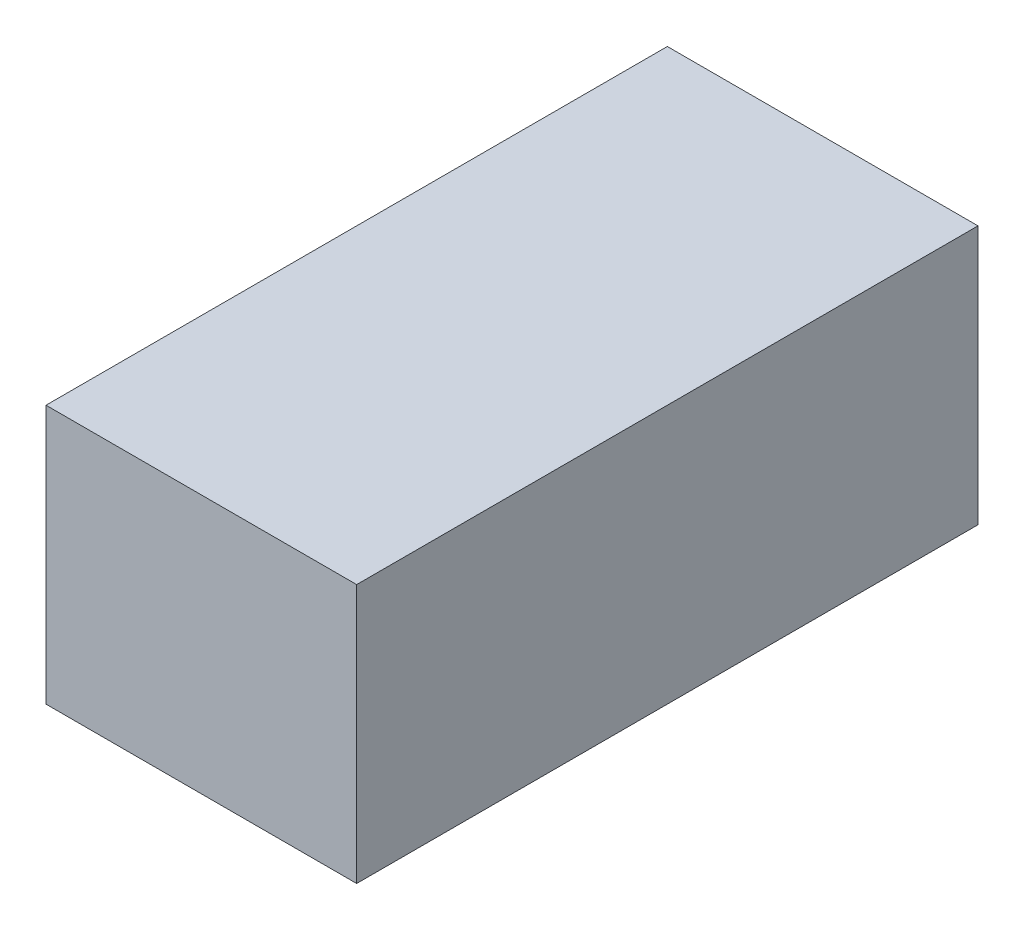
ISO-10303-21;
HEADER;
FILE_DESCRIPTION(('STEP AP214'),'2;1');
FILE_NAME('part.step','',(''),(''),'','','');
FILE_SCHEMA(('AUTOMOTIVE_DESIGN { 1 0 10303 214 1 1 1 1 }'));
ENDSEC;
DATA;
#1=APPLICATION_CONTEXT('core data for automotive mechanical design processes');
#2=APPLICATION_PROTOCOL_DEFINITION('international standard','automotive_design',2000,#1);
#3=PRODUCT_CONTEXT('',#1,'mechanical');
#4=PRODUCT('Part','Part','',(#3));
#5=PRODUCT_RELATED_PRODUCT_CATEGORY('part','',(#4));
#6=PRODUCT_DEFINITION_FORMATION('','',#4);
#7=PRODUCT_DEFINITION_CONTEXT('part definition',#1,'design');
#8=PRODUCT_DEFINITION('design','',#6,#7);
#9=PRODUCT_DEFINITION_SHAPE('','',#8);
#10=(LENGTH_UNIT() NAMED_UNIT(*) SI_UNIT(.MILLI.,.METRE.));
#11=(NAMED_UNIT(*) PLANE_ANGLE_UNIT() SI_UNIT($,.RADIAN.));
#12=(NAMED_UNIT(*) SI_UNIT($,.STERADIAN.) SOLID_ANGLE_UNIT());
#13=UNCERTAINTY_MEASURE_WITH_UNIT(LENGTH_MEASURE(1.E-05),#10,'distance_accuracy_value','');
#14=(GEOMETRIC_REPRESENTATION_CONTEXT(3) GLOBAL_UNCERTAINTY_ASSIGNED_CONTEXT((#13)) GLOBAL_UNIT_ASSIGNED_CONTEXT((#10,
#11,#12)) REPRESENTATION_CONTEXT('',''));
#15=CARTESIAN_POINT('',(0.,0.,0.));
#16=DIRECTION('',(0.,0.,1.));
#17=DIRECTION('',(1.,0.,0.));
#18=AXIS2_PLACEMENT_3D('',#15,#16,#17);
#19=CARTESIAN_POINT('',(152.4,254.,-304.8));
#20=DIRECTION('',(-1.,0.,0.));
#21=DIRECTION('',(0.,0.,1.));
#22=AXIS2_PLACEMENT_3D('',#19,#20,#21);
#23=PLANE('',#22);
#24=DIRECTION('',(0.,0.,-1.));
#25=VECTOR('',#24,1.);
#26=CARTESIAN_POINT('',(152.4,0.,-304.8));
#27=LINE('',#26,#25);
#28=CARTESIAN_POINT('',(152.4,0.,304.8));
#29=VERTEX_POINT('',#28);
#30=CARTESIAN_POINT('',(152.4,0.,-304.8));
#31=VERTEX_POINT('',#30);
#32=EDGE_CURVE('E103',#29,#31,#27,.T.);
#33=ORIENTED_EDGE('',*,*,#32,.T.);
#34=DIRECTION('',(0.,-1.,0.));
#35=VECTOR('',#34,1.);
#36=CARTESIAN_POINT('',(152.4,254.,-304.8));
#37=LINE('',#36,#35);
#38=CARTESIAN_POINT('',(152.4,254.,-304.8));
#39=VERTEX_POINT('',#38);
#40=EDGE_CURVE('E11',#39,#31,#37,.T.);
#41=ORIENTED_EDGE('',*,*,#40,.F.);
#42=DIRECTION('',(0.,0.,-1.));
#43=VECTOR('',#42,1.);
#44=CARTESIAN_POINT('',(152.4,254.,-304.8));
#45=LINE('',#44,#43);
#46=CARTESIAN_POINT('',(152.4,254.,304.8));
#47=VERTEX_POINT('',#46);
#48=EDGE_CURVE('E91',#47,#39,#45,.T.);
#49=ORIENTED_EDGE('',*,*,#48,.F.);
#50=DIRECTION('',(0.,-1.,0.));
#51=VECTOR('',#50,1.);
#52=CARTESIAN_POINT('',(152.4,254.,304.8));
#53=LINE('',#52,#51);
#54=EDGE_CURVE('E99',#47,#29,#53,.T.);
#55=ORIENTED_EDGE('',*,*,#54,.T.);
#56=EDGE_LOOP('',(#33,#41,#49,#55));
#57=FACE_BOUND('',#56,.T.);
#58=ADVANCED_FACE('F40',(#57),#23,.F.);
#59=CARTESIAN_POINT('',(-152.4,254.,-304.8));
#60=DIRECTION('',(0.,0.,1.));
#61=DIRECTION('',(1.,0.,0.));
#62=AXIS2_PLACEMENT_3D('',#59,#60,#61);
#63=PLANE('',#62);
#64=DIRECTION('',(-1.,0.,0.));
#65=VECTOR('',#64,1.);
#66=CARTESIAN_POINT('',(-152.4,0.,-304.8));
#67=LINE('',#66,#65);
#68=CARTESIAN_POINT('',(-152.4,0.,-304.8));
#69=VERTEX_POINT('',#68);
#70=EDGE_CURVE('E95',#31,#69,#67,.T.);
#71=ORIENTED_EDGE('',*,*,#70,.T.);
#72=DIRECTION('',(0.,-1.,0.));
#73=VECTOR('',#72,1.);
#74=CARTESIAN_POINT('',(-152.4,254.,-304.8));
#75=LINE('',#74,#73);
#76=CARTESIAN_POINT('',(-152.4,254.,-304.8));
#77=VERTEX_POINT('',#76);
#78=EDGE_CURVE('E48',#77,#69,#75,.T.);
#79=ORIENTED_EDGE('',*,*,#78,.F.);
#80=DIRECTION('',(-1.,0.,0.));
#81=VECTOR('',#80,1.);
#82=CARTESIAN_POINT('',(-152.4,254.,-304.8));
#83=LINE('',#82,#81);
#84=EDGE_CURVE('E86',#39,#77,#83,.T.);
#85=ORIENTED_EDGE('',*,*,#84,.F.);
#86=ORIENTED_EDGE('',*,*,#40,.T.);
#87=EDGE_LOOP('',(#71,#79,#85,#86));
#88=FACE_BOUND('',#87,.T.);
#89=ADVANCED_FACE('F94',(#88),#63,.F.);
#90=CARTESIAN_POINT('',(-152.4,254.,-304.8));
#91=DIRECTION('',(1.,0.,0.));
#92=DIRECTION('',(0.,0.,-1.));
#93=AXIS2_PLACEMENT_3D('',#90,#91,#92);
#94=PLANE('',#93);
#95=DIRECTION('',(0.,0.,1.));
#96=VECTOR('',#95,1.);
#97=CARTESIAN_POINT('',(-152.4,0.,-304.8));
#98=LINE('',#97,#96);
#99=CARTESIAN_POINT('',(-152.4,0.,304.8));
#100=VERTEX_POINT('',#99);
#101=EDGE_CURVE('E73',#69,#100,#98,.T.);
#102=ORIENTED_EDGE('',*,*,#101,.T.);
#103=DIRECTION('',(0.,-1.,0.));
#104=VECTOR('',#103,1.);
#105=CARTESIAN_POINT('',(-152.4,254.,304.8));
#106=LINE('',#105,#104);
#107=CARTESIAN_POINT('',(-152.4,254.,304.8));
#108=VERTEX_POINT('',#107);
#109=EDGE_CURVE('E96',#108,#100,#106,.T.);
#110=ORIENTED_EDGE('',*,*,#109,.F.);
#111=DIRECTION('',(0.,0.,1.));
#112=VECTOR('',#111,1.);
#113=CARTESIAN_POINT('',(-152.4,254.,-304.8));
#114=LINE('',#113,#112);
#115=EDGE_CURVE('E89',#77,#108,#114,.T.);
#116=ORIENTED_EDGE('',*,*,#115,.F.);
#117=ORIENTED_EDGE('',*,*,#78,.T.);
#118=EDGE_LOOP('',(#102,#110,#116,#117));
#119=FACE_BOUND('',#118,.T.);
#120=ADVANCED_FACE('F97',(#119),#94,.F.);
#121=CARTESIAN_POINT('',(-152.4,254.,304.8));
#122=DIRECTION('',(0.,0.,-1.));
#123=DIRECTION('',(-1.,0.,0.));
#124=AXIS2_PLACEMENT_3D('',#121,#122,#123);
#125=PLANE('',#124);
#126=DIRECTION('',(1.,0.,0.));
#127=VECTOR('',#126,1.);
#128=CARTESIAN_POINT('',(-152.4,0.,304.8));
#129=LINE('',#128,#127);
#130=EDGE_CURVE('E79',#100,#29,#129,.T.);
#131=ORIENTED_EDGE('',*,*,#130,.T.);
#132=ORIENTED_EDGE('',*,*,#54,.F.);
#133=DIRECTION('',(1.,0.,0.));
#134=VECTOR('',#133,1.);
#135=CARTESIAN_POINT('',(-152.4,254.,304.8));
#136=LINE('',#135,#134);
#137=EDGE_CURVE('E56',#108,#47,#136,.T.);
#138=ORIENTED_EDGE('',*,*,#137,.F.);
#139=ORIENTED_EDGE('',*,*,#109,.T.);
#140=EDGE_LOOP('',(#131,#132,#138,#139));
#141=FACE_BOUND('',#140,.T.);
#142=ADVANCED_FACE('F110',(#141),#125,.F.);
#143=CARTESIAN_POINT('',(0.,254.,0.));
#144=DIRECTION('',(0.,1.,0.));
#145=DIRECTION('',(0.,0.,1.));
#146=AXIS2_PLACEMENT_3D('',#143,#144,#145);
#147=PLANE('',#146);
#148=ORIENTED_EDGE('',*,*,#48,.T.);
#149=ORIENTED_EDGE('',*,*,#84,.T.);
#150=ORIENTED_EDGE('',*,*,#115,.T.);
#151=ORIENTED_EDGE('',*,*,#137,.T.);
#152=EDGE_LOOP('',(#148,#149,#150,#151));
#153=FACE_BOUND('',#152,.T.);
#154=ADVANCED_FACE('F87',(#153),#147,.T.);
#155=CARTESIAN_POINT('',(0.,0.,0.));
#156=DIRECTION('',(0.,1.,0.));
#157=DIRECTION('',(0.,0.,1.));
#158=AXIS2_PLACEMENT_3D('',#155,#156,#157);
#159=PLANE('',#158);
#160=ORIENTED_EDGE('',*,*,#32,.F.);
#161=ORIENTED_EDGE('',*,*,#130,.F.);
#162=ORIENTED_EDGE('',*,*,#101,.F.);
#163=ORIENTED_EDGE('',*,*,#70,.F.);
#164=EDGE_LOOP('',(#160,#161,#162,#163));
#165=FACE_BOUND('',#164,.T.);
#166=ADVANCED_FACE('F113',(#165),#159,.F.);
#167=CLOSED_SHELL('',(#58,#89,#120,#142,#154,#166));
#168=MANIFOLD_SOLID_BREP('B2',#167);
#169=ADVANCED_BREP_SHAPE_REPRESENTATION('',(#18,#168),#14);
#170=SHAPE_DEFINITION_REPRESENTATION(#9,#169);
ENDSEC;
END-ISO-10303-21;
